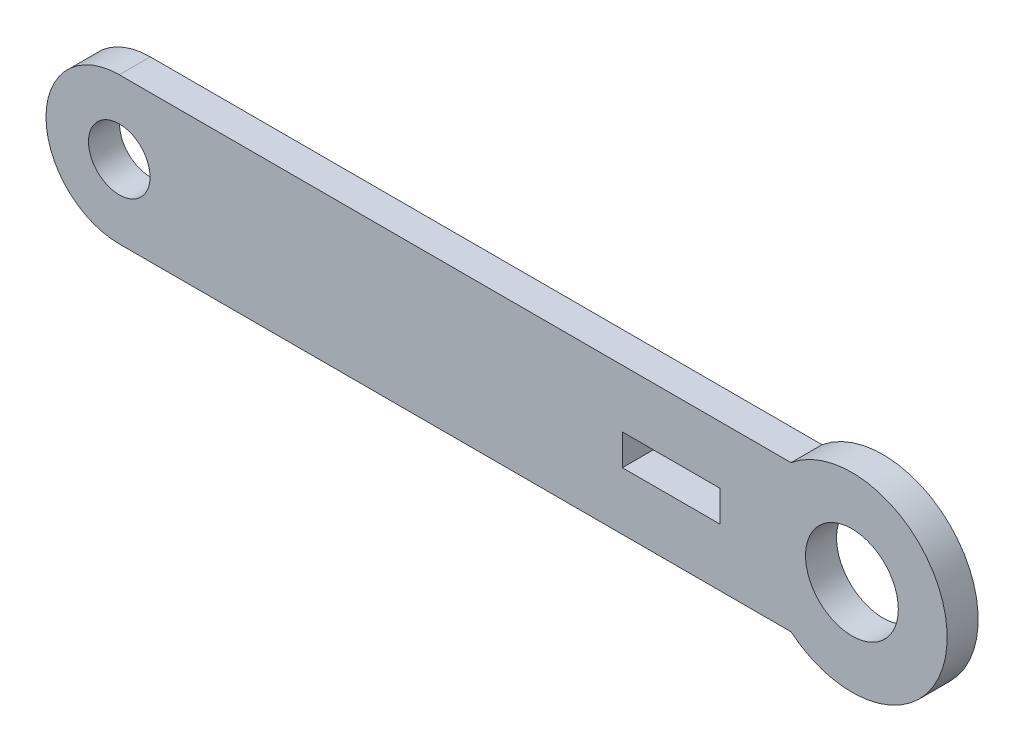
ISO-10303-21;
HEADER;
FILE_DESCRIPTION(('STEP AP214'),'2;1');
FILE_NAME('part.step','',(''),(''),'','','');
FILE_SCHEMA(('AUTOMOTIVE_DESIGN { 1 0 10303 214 1 1 1 1 }'));
ENDSEC;
DATA;
#1=APPLICATION_CONTEXT('core data for automotive mechanical design processes');
#2=APPLICATION_PROTOCOL_DEFINITION('international standard','automotive_design',2000,#1);
#3=PRODUCT_CONTEXT('',#1,'mechanical');
#4=PRODUCT('Part','Part','',(#3));
#5=PRODUCT_RELATED_PRODUCT_CATEGORY('part','',(#4));
#6=PRODUCT_DEFINITION_FORMATION('','',#4);
#7=PRODUCT_DEFINITION_CONTEXT('part definition',#1,'design');
#8=PRODUCT_DEFINITION('design','',#6,#7);
#9=PRODUCT_DEFINITION_SHAPE('','',#8);
#10=(LENGTH_UNIT() NAMED_UNIT(*) SI_UNIT(.MILLI.,.METRE.));
#11=(NAMED_UNIT(*) PLANE_ANGLE_UNIT() SI_UNIT($,.RADIAN.));
#12=(NAMED_UNIT(*) SI_UNIT($,.STERADIAN.) SOLID_ANGLE_UNIT());
#13=UNCERTAINTY_MEASURE_WITH_UNIT(LENGTH_MEASURE(1.E-05),#10,'distance_accuracy_value','');
#14=(GEOMETRIC_REPRESENTATION_CONTEXT(3) GLOBAL_UNCERTAINTY_ASSIGNED_CONTEXT((#13)) GLOBAL_UNIT_ASSIGNED_CONTEXT((#10,
#11,#12)) REPRESENTATION_CONTEXT('',''));
#15=CARTESIAN_POINT('',(0.,0.,0.));
#16=DIRECTION('',(0.,0.,1.));
#17=DIRECTION('',(1.,0.,0.));
#18=AXIS2_PLACEMENT_3D('',#15,#16,#17);
#19=CARTESIAN_POINT('',(0.,0.,0.));
#20=DIRECTION('',(0.,0.,1.));
#21=DIRECTION('',(1.,0.,0.));
#22=AXIS2_PLACEMENT_3D('',#19,#20,#21);
#23=PLANE('',#22);
#24=DIRECTION('',(1.,0.,0.));
#25=VECTOR('',#24,1.);
#26=CARTESIAN_POINT('',(14.,1.5875,0.));
#27=LINE('',#26,#25);
#28=CARTESIAN_POINT('',(14.,1.5875,0.));
#29=VERTEX_POINT('',#28);
#30=CARTESIAN_POINT('',(24.,1.5875,0.));
#31=VERTEX_POINT('',#30);
#32=EDGE_CURVE('E140',#29,#31,#27,.T.);
#33=ORIENTED_EDGE('',*,*,#32,.F.);
#34=DIRECTION('',(0.,1.,0.));
#35=VECTOR('',#34,1.);
#36=CARTESIAN_POINT('',(14.,-1.5875,0.));
#37=LINE('',#36,#35);
#38=CARTESIAN_POINT('',(14.,-1.5875,0.));
#39=VERTEX_POINT('',#38);
#40=EDGE_CURVE('E151',#39,#29,#37,.T.);
#41=ORIENTED_EDGE('',*,*,#40,.F.);
#42=DIRECTION('',(1.,0.,0.));
#43=VECTOR('',#42,1.);
#44=CARTESIAN_POINT('',(14.,-1.5875,0.));
#45=LINE('',#44,#43);
#46=CARTESIAN_POINT('',(24.,-1.5875,0.));
#47=VERTEX_POINT('',#46);
#48=EDGE_CURVE('E77',#39,#47,#45,.T.);
#49=ORIENTED_EDGE('',*,*,#48,.T.);
#50=DIRECTION('',(0.,1.,0.));
#51=VECTOR('',#50,1.);
#52=CARTESIAN_POINT('',(24.,-1.5875,0.));
#53=LINE('',#52,#51);
#54=EDGE_CURVE('E154',#47,#31,#53,.T.);
#55=ORIENTED_EDGE('',*,*,#54,.T.);
#56=EDGE_LOOP('',(#33,#41,#49,#55));
#57=FACE_BOUND('',#56,.T.);
#58=DIRECTION('',(1.,0.,0.));
#59=VECTOR('',#58,1.);
#60=CARTESIAN_POINT('',(0.,-7.5,0.));
#61=LINE('',#60,#59);
#62=CARTESIAN_POINT('',(-37.5,-7.5,0.));
#63=VERTEX_POINT('',#62);
#64=CARTESIAN_POINT('',(31.2700321028114,-7.5,0.));
#65=VERTEX_POINT('',#64);
#66=EDGE_CURVE('E171',#63,#65,#61,.T.);
#67=ORIENTED_EDGE('',*,*,#66,.F.);
#68=CARTESIAN_POINT('',(-37.5,0.,0.));
#69=DIRECTION('',(0.,0.,1.));
#70=DIRECTION('',(1.,0.,0.));
#71=AXIS2_PLACEMENT_3D('',#68,#69,#70);
#72=CIRCLE('',#71,7.5);
#73=CARTESIAN_POINT('',(-37.5,7.5,0.));
#74=VERTEX_POINT('',#73);
#75=EDGE_CURVE('E178',#74,#63,#72,.T.);
#76=ORIENTED_EDGE('',*,*,#75,.F.);
#77=DIRECTION('',(1.,0.,0.));
#78=VECTOR('',#77,1.);
#79=CARTESIAN_POINT('',(0.,7.5,0.));
#80=LINE('',#79,#78);
#81=CARTESIAN_POINT('',(31.2700321028114,7.5,0.));
#82=VERTEX_POINT('',#81);
#83=EDGE_CURVE('E174',#74,#82,#80,.T.);
#84=ORIENTED_EDGE('',*,*,#83,.T.);
#85=CARTESIAN_POINT('',(37.5,0.,0.));
#86=DIRECTION('',(0.,0.,1.));
#87=DIRECTION('',(1.,0.,0.));
#88=AXIS2_PLACEMENT_3D('',#85,#86,#87);
#89=CIRCLE('',#88,9.75);
#90=EDGE_CURVE('E64',#65,#82,#89,.T.);
#91=ORIENTED_EDGE('',*,*,#90,.F.);
#92=EDGE_LOOP('',(#67,#76,#84,#91));
#93=FACE_BOUND('',#92,.T.);
#94=CARTESIAN_POINT('',(-37.5,0.,0.));
#95=DIRECTION('',(0.,0.,1.));
#96=DIRECTION('',(1.,0.,0.));
#97=AXIS2_PLACEMENT_3D('',#94,#95,#96);
#98=CIRCLE('',#97,3.15);
#99=CARTESIAN_POINT('',(-34.35,0.,0.));
#100=VERTEX_POINT('',#99);
#101=EDGE_CURVE('E162',#100,#100,#98,.T.);
#102=ORIENTED_EDGE('',*,*,#101,.T.);
#103=EDGE_LOOP('',(#102));
#104=FACE_BOUND('',#103,.T.);
#105=CARTESIAN_POINT('',(37.5,0.,0.));
#106=DIRECTION('',(0.,0.,1.));
#107=DIRECTION('',(1.,0.,0.));
#108=AXIS2_PLACEMENT_3D('',#105,#106,#107);
#109=CIRCLE('',#108,4.75);
#110=CARTESIAN_POINT('',(42.25,0.,0.));
#111=VERTEX_POINT('',#110);
#112=EDGE_CURVE('E150',#111,#111,#109,.T.);
#113=ORIENTED_EDGE('',*,*,#112,.T.);
#114=EDGE_LOOP('',(#113));
#115=FACE_BOUND('',#114,.T.);
#116=ADVANCED_FACE('F60',(#57,#93,#104,#115),#23,.F.);
#117=CARTESIAN_POINT('',(0.,0.,3.175));
#118=DIRECTION('',(0.,0.,1.));
#119=DIRECTION('',(1.,0.,0.));
#120=AXIS2_PLACEMENT_3D('',#117,#118,#119);
#121=PLANE('',#120);
#122=DIRECTION('',(1.,0.,0.));
#123=VECTOR('',#122,1.);
#124=CARTESIAN_POINT('',(0.,-7.5,3.175));
#125=LINE('',#124,#123);
#126=CARTESIAN_POINT('',(-37.5,-7.5,3.175));
#127=VERTEX_POINT('',#126);
#128=CARTESIAN_POINT('',(31.2700321028114,-7.5,3.175));
#129=VERTEX_POINT('',#128);
#130=EDGE_CURVE('E158',#127,#129,#125,.T.);
#131=ORIENTED_EDGE('',*,*,#130,.T.);
#132=CARTESIAN_POINT('',(37.5,0.,3.175));
#133=DIRECTION('',(0.,0.,1.));
#134=DIRECTION('',(1.,0.,0.));
#135=AXIS2_PLACEMENT_3D('',#132,#133,#134);
#136=CIRCLE('',#135,9.75);
#137=CARTESIAN_POINT('',(31.2700321028114,7.5,3.175));
#138=VERTEX_POINT('',#137);
#139=EDGE_CURVE('E175',#129,#138,#136,.T.);
#140=ORIENTED_EDGE('',*,*,#139,.T.);
#141=DIRECTION('',(1.,0.,0.));
#142=VECTOR('',#141,1.);
#143=CARTESIAN_POINT('',(0.,7.5,3.175));
#144=LINE('',#143,#142);
#145=CARTESIAN_POINT('',(-37.5,7.5,3.175));
#146=VERTEX_POINT('',#145);
#147=EDGE_CURVE('E161',#146,#138,#144,.T.);
#148=ORIENTED_EDGE('',*,*,#147,.F.);
#149=CARTESIAN_POINT('',(-37.5,0.,3.175));
#150=DIRECTION('',(0.,0.,1.));
#151=DIRECTION('',(1.,0.,0.));
#152=AXIS2_PLACEMENT_3D('',#149,#150,#151);
#153=CIRCLE('',#152,7.5);
#154=EDGE_CURVE('E165',#146,#127,#153,.T.);
#155=ORIENTED_EDGE('',*,*,#154,.T.);
#156=EDGE_LOOP('',(#131,#140,#148,#155));
#157=FACE_BOUND('',#156,.T.);
#158=CARTESIAN_POINT('',(-37.5,0.,3.175));
#159=DIRECTION('',(0.,0.,1.));
#160=DIRECTION('',(1.,0.,0.));
#161=AXIS2_PLACEMENT_3D('',#158,#159,#160);
#162=CIRCLE('',#161,3.15);
#163=CARTESIAN_POINT('',(-34.35,0.,3.175));
#164=VERTEX_POINT('',#163);
#165=EDGE_CURVE('E167',#164,#164,#162,.T.);
#166=ORIENTED_EDGE('',*,*,#165,.F.);
#167=EDGE_LOOP('',(#166));
#168=FACE_BOUND('',#167,.T.);
#169=CARTESIAN_POINT('',(37.5,0.,3.175));
#170=DIRECTION('',(0.,0.,1.));
#171=DIRECTION('',(1.,0.,0.));
#172=AXIS2_PLACEMENT_3D('',#169,#170,#171);
#173=CIRCLE('',#172,4.75);
#174=CARTESIAN_POINT('',(42.25,0.,3.175));
#175=VERTEX_POINT('',#174);
#176=EDGE_CURVE('E187',#175,#175,#173,.T.);
#177=ORIENTED_EDGE('',*,*,#176,.F.);
#178=EDGE_LOOP('',(#177));
#179=FACE_BOUND('',#178,.T.);
#180=DIRECTION('',(0.,1.,0.));
#181=VECTOR('',#180,1.);
#182=CARTESIAN_POINT('',(14.,-1.5875,3.175));
#183=LINE('',#182,#181);
#184=CARTESIAN_POINT('',(14.,-1.5875,3.175));
#185=VERTEX_POINT('',#184);
#186=CARTESIAN_POINT('',(14.,1.5875,3.175));
#187=VERTEX_POINT('',#186);
#188=EDGE_CURVE('E137',#185,#187,#183,.T.);
#189=ORIENTED_EDGE('',*,*,#188,.T.);
#190=DIRECTION('',(1.,0.,0.));
#191=VECTOR('',#190,1.);
#192=CARTESIAN_POINT('',(14.,1.5875,3.175));
#193=LINE('',#192,#191);
#194=CARTESIAN_POINT('',(24.,1.5875,3.175));
#195=VERTEX_POINT('',#194);
#196=EDGE_CURVE('E85',#187,#195,#193,.T.);
#197=ORIENTED_EDGE('',*,*,#196,.T.);
#198=DIRECTION('',(0.,1.,0.));
#199=VECTOR('',#198,1.);
#200=CARTESIAN_POINT('',(24.,-1.5875,3.175));
#201=LINE('',#200,#199);
#202=CARTESIAN_POINT('',(24.,-1.5875,3.175));
#203=VERTEX_POINT('',#202);
#204=EDGE_CURVE('E144',#203,#195,#201,.T.);
#205=ORIENTED_EDGE('',*,*,#204,.F.);
#206=DIRECTION('',(1.,0.,0.));
#207=VECTOR('',#206,1.);
#208=CARTESIAN_POINT('',(14.,-1.5875,3.175));
#209=LINE('',#208,#207);
#210=EDGE_CURVE('E129',#185,#203,#209,.T.);
#211=ORIENTED_EDGE('',*,*,#210,.F.);
#212=EDGE_LOOP('',(#189,#197,#205,#211));
#213=FACE_BOUND('',#212,.T.);
#214=ADVANCED_FACE('F142',(#157,#168,#179,#213),#121,.T.);
#215=CARTESIAN_POINT('',(-37.5,0.,3.175));
#216=DIRECTION('',(0.,0.,-1.));
#217=DIRECTION('',(-1.,0.,0.));
#218=AXIS2_PLACEMENT_3D('',#215,#216,#217);
#219=CYLINDRICAL_SURFACE('',#218,3.15);
#220=ORIENTED_EDGE('',*,*,#165,.T.);
#221=EDGE_LOOP('',(#220));
#222=FACE_BOUND('',#221,.T.);
#223=ORIENTED_EDGE('',*,*,#101,.F.);
#224=EDGE_LOOP('',(#223));
#225=FACE_BOUND('',#224,.T.);
#226=ADVANCED_FACE('F231',(#222,#225),#219,.F.);
#227=CARTESIAN_POINT('',(0.,7.5,3.175));
#228=DIRECTION('',(0.,1.,0.));
#229=DIRECTION('',(0.,0.,1.));
#230=AXIS2_PLACEMENT_3D('',#227,#228,#229);
#231=PLANE('',#230);
#232=ORIENTED_EDGE('',*,*,#83,.F.);
#233=DIRECTION('',(0.,0.,-1.));
#234=VECTOR('',#233,1.);
#235=CARTESIAN_POINT('',(-37.5,7.5,3.175));
#236=LINE('',#235,#234);
#237=EDGE_CURVE('E184',#146,#74,#236,.T.);
#238=ORIENTED_EDGE('',*,*,#237,.F.);
#239=ORIENTED_EDGE('',*,*,#147,.T.);
#240=DIRECTION('',(0.,0.,-1.));
#241=VECTOR('',#240,1.);
#242=CARTESIAN_POINT('',(31.2700321028114,7.5,3.175));
#243=LINE('',#242,#241);
#244=EDGE_CURVE('E69',#138,#82,#243,.T.);
#245=ORIENTED_EDGE('',*,*,#244,.T.);
#246=EDGE_LOOP('',(#232,#238,#239,#245));
#247=FACE_BOUND('',#246,.T.);
#248=ADVANCED_FACE('F204',(#247),#231,.T.);
#249=CARTESIAN_POINT('',(-37.5,0.,3.175));
#250=DIRECTION('',(0.,0.,-1.));
#251=DIRECTION('',(-1.,0.,0.));
#252=AXIS2_PLACEMENT_3D('',#249,#250,#251);
#253=CYLINDRICAL_SURFACE('',#252,7.5);
#254=ORIENTED_EDGE('',*,*,#75,.T.);
#255=DIRECTION('',(0.,0.,-1.));
#256=VECTOR('',#255,1.);
#257=CARTESIAN_POINT('',(-37.5,-7.5,3.175));
#258=LINE('',#257,#256);
#259=EDGE_CURVE('E170',#127,#63,#258,.T.);
#260=ORIENTED_EDGE('',*,*,#259,.F.);
#261=ORIENTED_EDGE('',*,*,#154,.F.);
#262=ORIENTED_EDGE('',*,*,#237,.T.);
#263=EDGE_LOOP('',(#254,#260,#261,#262));
#264=FACE_BOUND('',#263,.T.);
#265=ADVANCED_FACE('F210',(#264),#253,.T.);
#266=CARTESIAN_POINT('',(0.,-7.5,3.175));
#267=DIRECTION('',(0.,1.,0.));
#268=DIRECTION('',(0.,0.,1.));
#269=AXIS2_PLACEMENT_3D('',#266,#267,#268);
#270=PLANE('',#269);
#271=ORIENTED_EDGE('',*,*,#66,.T.);
#272=DIRECTION('',(0.,0.,-1.));
#273=VECTOR('',#272,1.);
#274=CARTESIAN_POINT('',(31.2700321028114,-7.5,3.175));
#275=LINE('',#274,#273);
#276=EDGE_CURVE('E12',#129,#65,#275,.T.);
#277=ORIENTED_EDGE('',*,*,#276,.F.);
#278=ORIENTED_EDGE('',*,*,#130,.F.);
#279=ORIENTED_EDGE('',*,*,#259,.T.);
#280=EDGE_LOOP('',(#271,#277,#278,#279));
#281=FACE_BOUND('',#280,.T.);
#282=ADVANCED_FACE('F212',(#281),#270,.F.);
#283=CARTESIAN_POINT('',(37.5,0.,3.175));
#284=DIRECTION('',(0.,0.,-1.));
#285=DIRECTION('',(-1.,0.,0.));
#286=AXIS2_PLACEMENT_3D('',#283,#284,#285);
#287=CYLINDRICAL_SURFACE('',#286,4.75);
#288=ORIENTED_EDGE('',*,*,#176,.T.);
#289=EDGE_LOOP('',(#288));
#290=FACE_BOUND('',#289,.T.);
#291=ORIENTED_EDGE('',*,*,#112,.F.);
#292=EDGE_LOOP('',(#291));
#293=FACE_BOUND('',#292,.T.);
#294=ADVANCED_FACE('F214',(#290,#293),#287,.F.);
#295=CARTESIAN_POINT('',(37.5,0.,3.175));
#296=DIRECTION('',(0.,0.,-1.));
#297=DIRECTION('',(-1.,0.,0.));
#298=AXIS2_PLACEMENT_3D('',#295,#296,#297);
#299=CYLINDRICAL_SURFACE('',#298,9.75);
#300=ORIENTED_EDGE('',*,*,#139,.F.);
#301=ORIENTED_EDGE('',*,*,#276,.T.);
#302=ORIENTED_EDGE('',*,*,#90,.T.);
#303=ORIENTED_EDGE('',*,*,#244,.F.);
#304=EDGE_LOOP('',(#300,#301,#302,#303));
#305=FACE_BOUND('',#304,.T.);
#306=ADVANCED_FACE('F62',(#305),#299,.T.);
#307=CARTESIAN_POINT('',(14.,1.5875,0.));
#308=DIRECTION('',(0.,-1.,0.));
#309=DIRECTION('',(0.,0.,-1.));
#310=AXIS2_PLACEMENT_3D('',#307,#308,#309);
#311=PLANE('',#310);
#312=ORIENTED_EDGE('',*,*,#196,.F.);
#313=DIRECTION('',(0.,0.,1.));
#314=VECTOR('',#313,1.);
#315=CARTESIAN_POINT('',(14.,1.5875,0.));
#316=LINE('',#315,#314);
#317=EDGE_CURVE('E133',#29,#187,#316,.T.);
#318=ORIENTED_EDGE('',*,*,#317,.F.);
#319=ORIENTED_EDGE('',*,*,#32,.T.);
#320=DIRECTION('',(0.,0.,1.));
#321=VECTOR('',#320,1.);
#322=CARTESIAN_POINT('',(24.,1.5875,0.));
#323=LINE('',#322,#321);
#324=EDGE_CURVE('E348',#31,#195,#323,.T.);
#325=ORIENTED_EDGE('',*,*,#324,.T.);
#326=EDGE_LOOP('',(#312,#318,#319,#325));
#327=FACE_BOUND('',#326,.T.);
#328=ADVANCED_FACE('F221',(#327),#311,.T.);
#329=CARTESIAN_POINT('',(24.,-1.5875,0.));
#330=DIRECTION('',(1.,0.,0.));
#331=DIRECTION('',(0.,0.,-1.));
#332=AXIS2_PLACEMENT_3D('',#329,#330,#331);
#333=PLANE('',#332);
#334=ORIENTED_EDGE('',*,*,#204,.T.);
#335=ORIENTED_EDGE('',*,*,#324,.F.);
#336=ORIENTED_EDGE('',*,*,#54,.F.);
#337=DIRECTION('',(0.,0.,1.));
#338=VECTOR('',#337,1.);
#339=CARTESIAN_POINT('',(24.,-1.5875,0.));
#340=LINE('',#339,#338);
#341=EDGE_CURVE('E134',#47,#203,#340,.T.);
#342=ORIENTED_EDGE('',*,*,#341,.T.);
#343=EDGE_LOOP('',(#334,#335,#336,#342));
#344=FACE_BOUND('',#343,.T.);
#345=ADVANCED_FACE('F277',(#344),#333,.F.);
#346=CARTESIAN_POINT('',(14.,-1.5875,0.));
#347=DIRECTION('',(0.,-1.,0.));
#348=DIRECTION('',(0.,0.,-1.));
#349=AXIS2_PLACEMENT_3D('',#346,#347,#348);
#350=PLANE('',#349);
#351=ORIENTED_EDGE('',*,*,#210,.T.);
#352=ORIENTED_EDGE('',*,*,#341,.F.);
#353=ORIENTED_EDGE('',*,*,#48,.F.);
#354=DIRECTION('',(0.,0.,1.));
#355=VECTOR('',#354,1.);
#356=CARTESIAN_POINT('',(14.,-1.5875,0.));
#357=LINE('',#356,#355);
#358=EDGE_CURVE('E125',#39,#185,#357,.T.);
#359=ORIENTED_EDGE('',*,*,#358,.T.);
#360=EDGE_LOOP('',(#351,#352,#353,#359));
#361=FACE_BOUND('',#360,.T.);
#362=ADVANCED_FACE('F127',(#361),#350,.F.);
#363=CARTESIAN_POINT('',(14.,-1.5875,0.));
#364=DIRECTION('',(1.,0.,0.));
#365=DIRECTION('',(0.,0.,-1.));
#366=AXIS2_PLACEMENT_3D('',#363,#364,#365);
#367=PLANE('',#366);
#368=ORIENTED_EDGE('',*,*,#188,.F.);
#369=ORIENTED_EDGE('',*,*,#358,.F.);
#370=ORIENTED_EDGE('',*,*,#40,.T.);
#371=ORIENTED_EDGE('',*,*,#317,.T.);
#372=EDGE_LOOP('',(#368,#369,#370,#371));
#373=FACE_BOUND('',#372,.T.);
#374=ADVANCED_FACE('F138',(#373),#367,.T.);
#375=CLOSED_SHELL('',(#116,#214,#226,#248,#265,#282,#294,#306,#328,#345,#362,#374));
#376=MANIFOLD_SOLID_BREP('B2',#375);
#377=ADVANCED_BREP_SHAPE_REPRESENTATION('',(#18,#376),#14);
#378=SHAPE_DEFINITION_REPRESENTATION(#9,#377);
ENDSEC;
END-ISO-10303-21;
